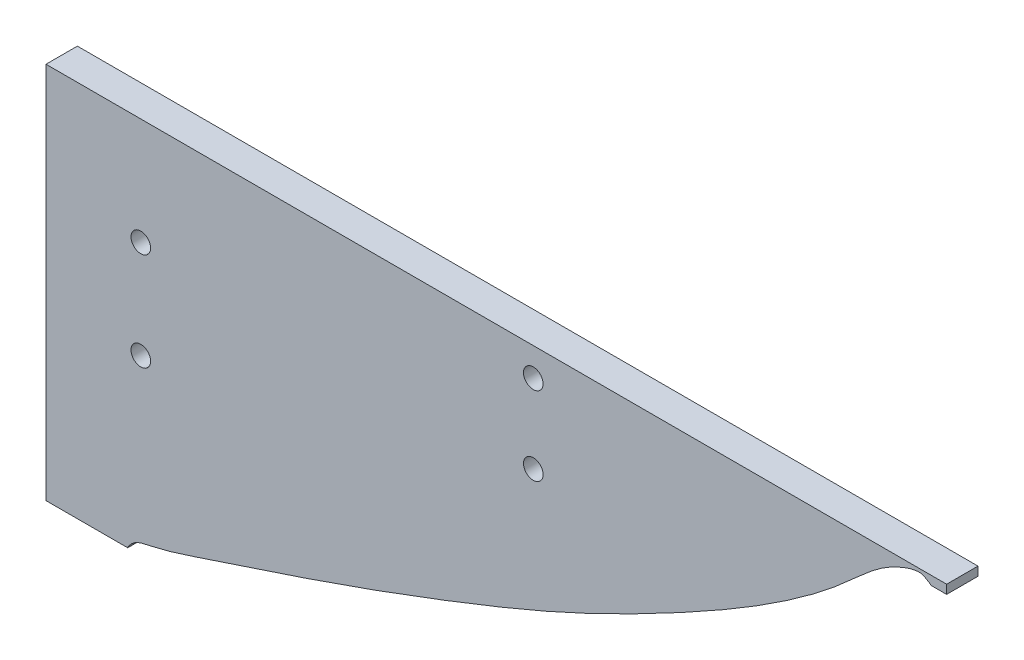
ISO-10303-21;
HEADER;
FILE_DESCRIPTION(('STEP AP214'),'2;1');
FILE_NAME('part.step','',(''),(''),'','','');
FILE_SCHEMA(('AUTOMOTIVE_DESIGN { 1 0 10303 214 1 1 1 1 }'));
ENDSEC;
DATA;
#1=APPLICATION_CONTEXT('core data for automotive mechanical design processes');
#2=APPLICATION_PROTOCOL_DEFINITION('international standard','automotive_design',2000,#1);
#3=PRODUCT_CONTEXT('',#1,'mechanical');
#4=PRODUCT('Part','Part','',(#3));
#5=PRODUCT_RELATED_PRODUCT_CATEGORY('part','',(#4));
#6=PRODUCT_DEFINITION_FORMATION('','',#4);
#7=PRODUCT_DEFINITION_CONTEXT('part definition',#1,'design');
#8=PRODUCT_DEFINITION('design','',#6,#7);
#9=PRODUCT_DEFINITION_SHAPE('','',#8);
#10=(LENGTH_UNIT() NAMED_UNIT(*) SI_UNIT(.MILLI.,.METRE.));
#11=(NAMED_UNIT(*) PLANE_ANGLE_UNIT() SI_UNIT($,.RADIAN.));
#12=(NAMED_UNIT(*) SI_UNIT($,.STERADIAN.) SOLID_ANGLE_UNIT());
#13=UNCERTAINTY_MEASURE_WITH_UNIT(LENGTH_MEASURE(1.E-05),#10,'distance_accuracy_value','');
#14=(GEOMETRIC_REPRESENTATION_CONTEXT(3) GLOBAL_UNCERTAINTY_ASSIGNED_CONTEXT((#13)) GLOBAL_UNIT_ASSIGNED_CONTEXT((#10,
#11,#12)) REPRESENTATION_CONTEXT('',''));
#15=CARTESIAN_POINT('',(0.,0.,0.));
#16=DIRECTION('',(0.,0.,1.));
#17=DIRECTION('',(1.,0.,0.));
#18=AXIS2_PLACEMENT_3D('',#15,#16,#17);
#19=CARTESIAN_POINT('',(-113.751743984979,-94.1062700443345,164.));
#20=DIRECTION('',(0.,0.,-1.));
#21=DIRECTION('',(-1.,0.,0.));
#22=AXIS2_PLACEMENT_3D('',#19,#20,#21);
#23=PLANE('',#22);
#24=CARTESIAN_POINT('',(-100.,-50.,164.));
#25=DIRECTION('',(0.,0.,-1.));
#26=DIRECTION('',(-1.,0.,0.));
#27=AXIS2_PLACEMENT_3D('',#24,#25,#26);
#28=CIRCLE('',#27,2.5);
#29=CARTESIAN_POINT('',(-102.5,-50.,164.));
#30=VERTEX_POINT('',#29);
#31=EDGE_CURVE('E207',#30,#30,#28,.F.);
#32=ORIENTED_EDGE('',*,*,#31,.F.);
#33=EDGE_LOOP('',(#32));
#34=FACE_BOUND('',#33,.T.);
#35=CARTESIAN_POINT('',(0.0705666698621599,-4.96037406111782,164.));
#36=DIRECTION('',(0.,0.,-1.));
#37=DIRECTION('',(-1.,0.,0.));
#38=AXIS2_PLACEMENT_3D('',#35,#36,#37);
#39=CIRCLE('',#38,2.5);
#40=CARTESIAN_POINT('',(-2.42943333013784,-4.96037406111782,164.));
#41=VERTEX_POINT('',#40);
#42=EDGE_CURVE('E203',#41,#41,#39,.F.);
#43=ORIENTED_EDGE('',*,*,#42,.F.);
#44=EDGE_LOOP('',(#43));
#45=FACE_BOUND('',#44,.T.);
#46=CARTESIAN_POINT('',(-103.335738248499,-94.101942914283,164.));
#47=CARTESIAN_POINT('',(-110.279741858673,-94.105282507355,164.));
#48=CARTESIAN_POINT('',(-117.223745960721,-94.1076749958076,164.));
#49=CARTESIAN_POINT('',(-124.167750173155,-94.1093449309054,164.));
#50=B_SPLINE_CURVE_WITH_KNOTS('',3,(#46,#47,#48,#49),.UNSPECIFIED.,.F.,.F.,(4,4),(0.,1.),.UNSPECIFIED.);
#51=CARTESIAN_POINT('',(-124.167750173155,-94.1093449309054,164.));
#52=VERTEX_POINT('',#51);
#53=CARTESIAN_POINT('',(-103.335738248499,-94.1019429142831,164.));
#54=VERTEX_POINT('',#53);
#55=EDGE_CURVE('E161',#52,#54,#50,.F.);
#56=ORIENTED_EDGE('',*,*,#55,.T.);
#57=CARTESIAN_POINT('',(101.392971002908,0.,164.));
#58=CARTESIAN_POINT('',(101.357979740018,0.068190974845596,164.));
#59=CARTESIAN_POINT('',(101.312259751955,0.130180594414461,164.));
#60=CARTESIAN_POINT('',(101.208007132626,0.239375916834823,164.));
#61=CARTESIAN_POINT('',(101.148823438813,0.288099413869145,164.));
#62=CARTESIAN_POINT('',(100.96386004211,0.423104213829059,164.));
#63=CARTESIAN_POINT('',(100.833204582962,0.501109621826331,164.));
#64=CARTESIAN_POINT('',(100.443182520159,0.73830115292209,164.));
#65=CARTESIAN_POINT('',(100.188555675596,0.90522789084138,164.));
#66=CARTESIAN_POINT('',(99.7805419205078,1.11303675559708,164.));
#67=CARTESIAN_POINT('',(99.6425820034649,1.1761913142262,164.));
#68=CARTESIAN_POINT('',(99.3592983750823,1.27931939161136,164.));
#69=CARTESIAN_POINT('',(99.2136623255998,1.31832692398525,164.));
#70=CARTESIAN_POINT('',(98.9152639127084,1.37393930102966,164.));
#71=CARTESIAN_POINT('',(98.762030141973,1.39046433640759,164.));
#72=CARTESIAN_POINT('',(98.4590300872123,1.40479846347273,164.));
#73=CARTESIAN_POINT('',(98.3079905188349,1.40293617943599,164.));
#74=CARTESIAN_POINT('',(97.8558429143128,1.37830657892934,164.));
#75=CARTESIAN_POINT('',(97.555027649507,1.3369050844726,164.));
#76=CARTESIAN_POINT('',(96.95759664681,1.2275966619729,164.));
#77=CARTESIAN_POINT('',(96.6631542560784,1.16103962624218,164.));
#78=CARTESIAN_POINT('',(95.790945562899,0.930397800976953,164.));
#79=CARTESIAN_POINT('',(95.2242489555142,0.735478181923143,164.));
#80=CARTESIAN_POINT('',(94.1046442302498,0.307230864748438,164.));
#81=CARTESIAN_POINT('',(93.552174654694,0.0726815993023446,164.));
#82=CARTESIAN_POINT('',(92.4603527379176,-0.432955217621019,164.));
#83=CARTESIAN_POINT('',(91.9202514383574,-0.703814257286526,164.));
#84=CARTESIAN_POINT('',(90.3358328449802,-1.55597254541287,164.));
#85=CARTESIAN_POINT('',(89.3220610695959,-2.18133859050563,164.));
#86=CARTESIAN_POINT('',(86.4043153585391,-4.22389431218765,164.));
#87=CARTESIAN_POINT('',(84.6154939618158,-5.79620313911845,164.));
#88=CARTESIAN_POINT('',(81.9584007689516,-8.18987745119697,164.));
#89=CARTESIAN_POINT('',(81.0760084523988,-8.99220379670843,164.));
#90=CARTESIAN_POINT('',(79.2948121414599,-10.5749627983275,164.));
#91=CARTESIAN_POINT('',(78.3977815598141,-11.3577721797525,164.));
#92=CARTESIAN_POINT('',(75.6724480026155,-13.6605789035911,164.));
#93=CARTESIAN_POINT('',(73.808154251943,-15.1326246285187,164.));
#94=CARTESIAN_POINT('',(70.0160592997156,-17.9921031468079,164.));
#95=CARTESIAN_POINT('',(68.0886874462912,-19.3801079738989,164.));
#96=CARTESIAN_POINT('',(64.1875447955719,-22.0942988870055,164.));
#97=CARTESIAN_POINT('',(62.2130224574577,-23.4194836720551,164.));
#98=CARTESIAN_POINT('',(58.2157142582294,-26.0055502649134,164.));
#99=CARTESIAN_POINT('',(56.1940211806163,-27.2669389252496,164.));
#100=CARTESIAN_POINT('',(52.1213904733241,-29.7357364883915,164.));
#101=CARTESIAN_POINT('',(50.0694521137147,-30.9440109694953,164.));
#102=CARTESIAN_POINT('',(45.9433407087062,-33.3233797876428,164.));
#103=CARTESIAN_POINT('',(43.869058606885,-34.4941949818839,164.));
#104=CARTESIAN_POINT('',(37.6197095530705,-37.9565610613408,164.));
#105=CARTESIAN_POINT('',(33.4167725220308,-40.1997349563943,164.));
#106=CARTESIAN_POINT('',(24.9571366174578,-44.5763972859292,164.));
#107=CARTESIAN_POINT('',(20.7007921032042,-46.7107537785107,164.));
#108=CARTESIAN_POINT('',(12.1185466451993,-50.8379374737022,164.));
#109=CARTESIAN_POINT('',(7.78892751637958,-52.8271833657396,164.));
#110=CARTESIAN_POINT('',(-0.93686045361445,-56.6480378714663,164.));
#111=CARTESIAN_POINT('',(-5.33198140330631,-58.4806654519202,164.));
#112=CARTESIAN_POINT('',(-14.1632962870766,-62.0467656114054,164.));
#113=CARTESIAN_POINT('',(-18.5983001543649,-63.7841269838945,164.));
#114=CARTESIAN_POINT('',(-27.4893002002402,-67.2027967759074,164.));
#115=CARTESIAN_POINT('',(-31.9458744530792,-68.8823291062009,164.));
#116=CARTESIAN_POINT('',(-40.8856414493109,-72.1697590507888,164.));
#117=CARTESIAN_POINT('',(-45.3695033104159,-73.7766223180661,164.));
#118=CARTESIAN_POINT('',(-54.362678798266,-76.9180042234424,164.));
#119=CARTESIAN_POINT('',(-58.8717588633553,-78.4526275518555,164.));
#120=CARTESIAN_POINT('',(-67.9018492888758,-81.4865682910888,164.));
#121=CARTESIAN_POINT('',(-72.4221643800262,-82.9878336641147,164.));
#122=CARTESIAN_POINT('',(-79.2053872172963,-85.2313458119901,164.));
#123=CARTESIAN_POINT('',(-81.4668429971368,-85.9780530829574,164.));
#124=CARTESIAN_POINT('',(-84.862097162731,-87.0887081801202,164.));
#125=CARTESIAN_POINT('',(-85.9943690295218,-87.4573312222522,164.));
#126=CARTESIAN_POINT('',(-88.2598665539023,-88.1916538319368,164.));
#127=CARTESIAN_POINT('',(-89.3921986933781,-88.5606335458748,164.));
#128=CARTESIAN_POINT('',(-91.6631776616176,-89.274972763368,164.));
#129=CARTESIAN_POINT('',(-92.802852417256,-89.6166166410121,164.));
#130=CARTESIAN_POINT('',(-94.5267961312985,-90.0755469010516,164.));
#131=CARTESIAN_POINT('',(-95.1037590980684,-90.2199356735893,164.));
#132=CARTESIAN_POINT('',(-96.2626988106407,-90.4901140466114,164.));
#133=CARTESIAN_POINT('',(-96.8456888153453,-90.6121448502808,164.));
#134=CARTESIAN_POINT('',(-98.0125509186469,-90.8529342320259,164.));
#135=CARTESIAN_POINT('',(-98.595260087011,-90.9760068293969,164.));
#136=CARTESIAN_POINT('',(-99.4582669239013,-91.201632586255,164.));
#137=CARTESIAN_POINT('',(-99.7438572238623,-91.2834156130484,164.));
#138=CARTESIAN_POINT('',(-100.306954414545,-91.4677858129975,164.));
#139=CARTESIAN_POINT('',(-100.584410762881,-91.5709472015601,164.));
#140=CARTESIAN_POINT('',(-101.125195334734,-91.8151646548845,164.));
#141=CARTESIAN_POINT('',(-101.390540825819,-91.958078572796,164.));
#142=CARTESIAN_POINT('',(-101.877557183888,-92.2877867261056,164.));
#143=CARTESIAN_POINT('',(-102.098498784361,-92.4783319788356,164.));
#144=CARTESIAN_POINT('',(-102.511988709742,-92.8917471293423,164.));
#145=CARTESIAN_POINT('',(-102.701463941397,-93.1183296851382,164.));
#146=CARTESIAN_POINT('',(-102.982389608421,-93.4612729552289,164.));
#147=CARTESIAN_POINT('',(-103.074450206361,-93.5767336294033,164.));
#148=CARTESIAN_POINT('',(-103.2377734881,-93.8227310294766,164.));
#149=CARTESIAN_POINT('',(-103.307943701218,-93.9561350127491,164.));
#150=CARTESIAN_POINT('',(-103.335738248499,-94.1019429142831,164.));
#151=B_SPLINE_CURVE_WITH_KNOTS('',3,(#57,#58,#59,#60,#61,#62,#63,#64,#65,#66,#67,#68,#69,#70,
#71,#72,#73,#74,#75,#76,#77,#78,#79,#80,#81,#82,#83,#84,#85,#86,#87,#88,#89,#90,#91,#92,#93,#94,
#95,#96,#97,#98,#99,#100,#101,#102,#103,#104,#105,#106,#107,#108,#109,#110,#111,#112,#113,#114,
#115,#116,#117,#118,#119,#120,#121,#122,#123,#124,#125,#126,#127,#128,#129,#130,#131,#132,#133,
#134,#135,#136,#137,#138,#139,#140,#141,#142,#143,#144,#145,#146,#147,#148,#149,#150),
.UNSPECIFIED.,.F.,.F.,(4,2,2,2,2,2,2,2,2,2,2,2,2,2,2,2,2,2,2,2,2,2,2,2,2,2,2,2,2,2,2,2,2,2,2,2,
2,2,2,2,2,2,2,2,2,2,4),(0.,0.000976562500000111,0.00195312500000022,0.00390625000000022,
0.00781250000000044,0.00976562500000044,0.0117187500000006,0.0136718750000006,
0.0156250000000007,0.0195312500000006,0.0234375000000006,0.0312500000000007,0.0390625000000007,
0.0468750000000008,0.0625000000000009,0.0937500000000011,0.109375000000001,0.125000000000001,
0.156250000000001,0.187500000000001,0.218750000000001,0.250000000000001,0.281250000000001,
0.312500000000001,0.375000000000001,0.437500000000001,0.500000000000001,0.562500000000001,
0.625000000000001,0.687500000000001,0.750000000000001,0.8125,0.875,0.90625,0.921875,0.9375,
0.953125,0.9609375,0.96875,0.9765625,0.98046875,0.984375,0.98828125,0.9921875,0.99609375,
0.998046875,1.),.UNSPECIFIED.);
#152=CARTESIAN_POINT('',(101.392971002908,0.,164.));
#153=VERTEX_POINT('',#152);
#154=EDGE_CURVE('E88',#54,#153,#151,.F.);
#155=ORIENTED_EDGE('',*,*,#154,.T.);
#156=DIRECTION('',(1.,0.,0.));
#157=VECTOR('',#156,1.);
#158=CARTESIAN_POINT('',(101.392971002908,0.,164.));
#159=LINE('',#158,#157);
#160=CARTESIAN_POINT('',(105.452125778528,0.,164.));
#161=VERTEX_POINT('',#160);
#162=EDGE_CURVE('E102',#153,#161,#159,.T.);
#163=ORIENTED_EDGE('',*,*,#162,.T.);
#164=DIRECTION('',(0.,1.,0.));
#165=VECTOR('',#164,1.);
#166=CARTESIAN_POINT('',(105.452125778528,2.25600000000004,164.));
#167=LINE('',#166,#165);
#168=CARTESIAN_POINT('',(105.452125778528,2.25600000000004,164.));
#169=VERTEX_POINT('',#168);
#170=EDGE_CURVE('E96',#161,#169,#167,.T.);
#171=ORIENTED_EDGE('',*,*,#170,.T.);
#172=DIRECTION('',(-1.,0.,0.));
#173=VECTOR('',#172,1.);
#174=CARTESIAN_POINT('',(105.452125778528,2.25600000000004,164.));
#175=LINE('',#174,#173);
#176=CARTESIAN_POINT('',(-124.167750173155,2.25600000000001,164.));
#177=VERTEX_POINT('',#176);
#178=EDGE_CURVE('E100',#169,#177,#175,.T.);
#179=ORIENTED_EDGE('',*,*,#178,.T.);
#180=DIRECTION('',(0.,-1.,0.));
#181=VECTOR('',#180,1.);
#182=CARTESIAN_POINT('',(-124.167750173155,-94.1093449309054,164.));
#183=LINE('',#182,#181);
#184=EDGE_CURVE('E51',#177,#52,#183,.T.);
#185=ORIENTED_EDGE('',*,*,#184,.T.);
#186=EDGE_LOOP('',(#56,#155,#163,#171,#179,#185));
#187=FACE_BOUND('',#186,.T.);
#188=CARTESIAN_POINT('',(0.0705666698621599,-25.,164.));
#189=DIRECTION('',(0.,0.,-1.));
#190=DIRECTION('',(-1.,0.,0.));
#191=AXIS2_PLACEMENT_3D('',#188,#189,#190);
#192=CIRCLE('',#191,2.5);
#193=CARTESIAN_POINT('',(-2.42943333013784,-25.,164.));
#194=VERTEX_POINT('',#193);
#195=EDGE_CURVE('E204',#194,#194,#192,.F.);
#196=ORIENTED_EDGE('',*,*,#195,.F.);
#197=EDGE_LOOP('',(#196));
#198=FACE_BOUND('',#197,.T.);
#199=CARTESIAN_POINT('',(-100.,-25.,164.));
#200=DIRECTION('',(0.,0.,-1.));
#201=DIRECTION('',(-1.,0.,0.));
#202=AXIS2_PLACEMENT_3D('',#199,#200,#201);
#203=CIRCLE('',#202,2.5);
#204=CARTESIAN_POINT('',(-102.5,-25.,164.));
#205=VERTEX_POINT('',#204);
#206=EDGE_CURVE('E210',#205,#205,#203,.F.);
#207=ORIENTED_EDGE('',*,*,#206,.F.);
#208=EDGE_LOOP('',(#207));
#209=FACE_BOUND('',#208,.T.);
#210=ADVANCED_FACE('F30',(#34,#45,#187,#198,#209),#23,.F.);
#211=CARTESIAN_POINT('',(-113.751743984979,-94.1062700443345,156.));
#212=DIRECTION('',(0.,0.,-1.));
#213=DIRECTION('',(-1.,0.,0.));
#214=AXIS2_PLACEMENT_3D('',#211,#212,#213);
#215=PLANE('',#214);
#216=CARTESIAN_POINT('',(-100.,-50.,156.));
#217=DIRECTION('',(0.,0.,-1.));
#218=DIRECTION('',(-1.,0.,0.));
#219=AXIS2_PLACEMENT_3D('',#216,#217,#218);
#220=CIRCLE('',#219,2.5);
#221=CARTESIAN_POINT('',(-102.5,-50.,156.));
#222=VERTEX_POINT('',#221);
#223=EDGE_CURVE('E208',#222,#222,#220,.F.);
#224=ORIENTED_EDGE('',*,*,#223,.T.);
#225=EDGE_LOOP('',(#224));
#226=FACE_BOUND('',#225,.T.);
#227=CARTESIAN_POINT('',(0.0705666698621599,-4.96037406111782,156.));
#228=DIRECTION('',(0.,0.,-1.));
#229=DIRECTION('',(-1.,0.,0.));
#230=AXIS2_PLACEMENT_3D('',#227,#228,#229);
#231=CIRCLE('',#230,2.5);
#232=CARTESIAN_POINT('',(-2.42943333013784,-4.96037406111782,156.));
#233=VERTEX_POINT('',#232);
#234=EDGE_CURVE('E200',#233,#233,#231,.F.);
#235=ORIENTED_EDGE('',*,*,#234,.T.);
#236=EDGE_LOOP('',(#235));
#237=FACE_BOUND('',#236,.T.);
#238=CARTESIAN_POINT('',(-124.167750173155,-94.1093449309054,156.));
#239=CARTESIAN_POINT('',(-117.223745960721,-94.1076749958076,156.));
#240=CARTESIAN_POINT('',(-110.279741858673,-94.105282507355,156.));
#241=CARTESIAN_POINT('',(-103.335738248499,-94.101942914283,156.));
#242=B_SPLINE_CURVE_WITH_KNOTS('',3,(#238,#239,#240,#241),.UNSPECIFIED.,.F.,.F.,(4,4),(0.,1.),.UNSPECIFIED.);
#243=CARTESIAN_POINT('',(-124.167750173155,-94.1093449309054,156.));
#244=VERTEX_POINT('',#243);
#245=CARTESIAN_POINT('',(-103.335738248499,-94.1019429142831,156.));
#246=VERTEX_POINT('',#245);
#247=EDGE_CURVE('E178',#244,#246,#242,.T.);
#248=ORIENTED_EDGE('',*,*,#247,.F.);
#249=DIRECTION('',(0.,-1.,0.));
#250=VECTOR('',#249,1.);
#251=CARTESIAN_POINT('',(-124.167750173155,-94.1093449309054,156.));
#252=LINE('',#251,#250);
#253=CARTESIAN_POINT('',(-124.167750173155,2.25600000000001,156.));
#254=VERTEX_POINT('',#253);
#255=EDGE_CURVE('E80',#254,#244,#252,.T.);
#256=ORIENTED_EDGE('',*,*,#255,.F.);
#257=DIRECTION('',(-1.,0.,0.));
#258=VECTOR('',#257,1.);
#259=CARTESIAN_POINT('',(105.452125778528,2.25600000000004,156.));
#260=LINE('',#259,#258);
#261=CARTESIAN_POINT('',(105.452125778528,2.25600000000004,156.));
#262=VERTEX_POINT('',#261);
#263=EDGE_CURVE('E74',#262,#254,#260,.T.);
#264=ORIENTED_EDGE('',*,*,#263,.F.);
#265=DIRECTION('',(0.,1.,0.));
#266=VECTOR('',#265,1.);
#267=CARTESIAN_POINT('',(105.452125778528,2.25600000000004,156.));
#268=LINE('',#267,#266);
#269=CARTESIAN_POINT('',(105.452125778528,0.,156.));
#270=VERTEX_POINT('',#269);
#271=EDGE_CURVE('E110',#270,#262,#268,.T.);
#272=ORIENTED_EDGE('',*,*,#271,.F.);
#273=DIRECTION('',(1.,0.,0.));
#274=VECTOR('',#273,1.);
#275=CARTESIAN_POINT('',(101.392971002908,0.,156.));
#276=LINE('',#275,#274);
#277=CARTESIAN_POINT('',(101.392971002908,0.,156.));
#278=VERTEX_POINT('',#277);
#279=EDGE_CURVE('E121',#278,#270,#276,.T.);
#280=ORIENTED_EDGE('',*,*,#279,.F.);
#281=CARTESIAN_POINT('',(-103.335738248499,-94.1019429142831,156.));
#282=CARTESIAN_POINT('',(-103.307943701218,-93.9561350127491,156.));
#283=CARTESIAN_POINT('',(-103.2377734881,-93.8227310294766,156.));
#284=CARTESIAN_POINT('',(-103.074450206361,-93.5767336294033,156.));
#285=CARTESIAN_POINT('',(-102.982389608421,-93.4612729552289,156.));
#286=CARTESIAN_POINT('',(-102.701463941397,-93.1183296851382,156.));
#287=CARTESIAN_POINT('',(-102.511988709742,-92.8917471293423,156.));
#288=CARTESIAN_POINT('',(-102.098498784361,-92.4783319788356,156.));
#289=CARTESIAN_POINT('',(-101.877557183888,-92.2877867261056,156.));
#290=CARTESIAN_POINT('',(-101.390540825819,-91.958078572796,156.));
#291=CARTESIAN_POINT('',(-101.125195334734,-91.8151646548845,156.));
#292=CARTESIAN_POINT('',(-100.584410762881,-91.5709472015601,156.));
#293=CARTESIAN_POINT('',(-100.306954414545,-91.4677858129975,156.));
#294=CARTESIAN_POINT('',(-99.7438572238623,-91.2834156130484,156.));
#295=CARTESIAN_POINT('',(-99.4582669239013,-91.201632586255,156.));
#296=CARTESIAN_POINT('',(-98.595260087011,-90.9760068293969,156.));
#297=CARTESIAN_POINT('',(-98.0125509186469,-90.8529342320259,156.));
#298=CARTESIAN_POINT('',(-96.8456888153453,-90.6121448502808,156.));
#299=CARTESIAN_POINT('',(-96.2626988106407,-90.4901140466114,156.));
#300=CARTESIAN_POINT('',(-95.1037590980684,-90.2199356735893,156.));
#301=CARTESIAN_POINT('',(-94.5267961312985,-90.0755469010516,156.));
#302=CARTESIAN_POINT('',(-92.802852417256,-89.6166166410121,156.));
#303=CARTESIAN_POINT('',(-91.6631776616176,-89.274972763368,156.));
#304=CARTESIAN_POINT('',(-89.3921986933781,-88.5606335458748,156.));
#305=CARTESIAN_POINT('',(-88.2598665539023,-88.1916538319368,156.));
#306=CARTESIAN_POINT('',(-85.9943690295218,-87.4573312222522,156.));
#307=CARTESIAN_POINT('',(-84.862097162731,-87.0887081801202,156.));
#308=CARTESIAN_POINT('',(-81.4668429971368,-85.9780530829574,156.));
#309=CARTESIAN_POINT('',(-79.2053872172963,-85.2313458119901,156.));
#310=CARTESIAN_POINT('',(-72.4221643800262,-82.9878336641147,156.));
#311=CARTESIAN_POINT('',(-67.9018492888758,-81.4865682910888,156.));
#312=CARTESIAN_POINT('',(-58.8717588633553,-78.4526275518555,156.));
#313=CARTESIAN_POINT('',(-54.362678798266,-76.9180042234424,156.));
#314=CARTESIAN_POINT('',(-45.3695033104159,-73.7766223180661,156.));
#315=CARTESIAN_POINT('',(-40.8856414493109,-72.1697590507888,156.));
#316=CARTESIAN_POINT('',(-31.9458744530792,-68.8823291062009,156.));
#317=CARTESIAN_POINT('',(-27.4893002002402,-67.2027967759074,156.));
#318=CARTESIAN_POINT('',(-18.5983001543649,-63.7841269838945,156.));
#319=CARTESIAN_POINT('',(-14.1632962870766,-62.0467656114054,156.));
#320=CARTESIAN_POINT('',(-5.33198140330631,-58.4806654519202,156.));
#321=CARTESIAN_POINT('',(-0.93686045361445,-56.6480378714663,156.));
#322=CARTESIAN_POINT('',(7.78892751637958,-52.8271833657396,156.));
#323=CARTESIAN_POINT('',(12.1185466451993,-50.8379374737022,156.));
#324=CARTESIAN_POINT('',(20.7007921032042,-46.7107537785107,156.));
#325=CARTESIAN_POINT('',(24.9571366174578,-44.5763972859292,156.));
#326=CARTESIAN_POINT('',(33.4167725220308,-40.1997349563943,156.));
#327=CARTESIAN_POINT('',(37.6197095530705,-37.9565610613408,156.));
#328=CARTESIAN_POINT('',(43.869058606885,-34.4941949818839,156.));
#329=CARTESIAN_POINT('',(45.9433407087062,-33.3233797876428,156.));
#330=CARTESIAN_POINT('',(50.0694521137147,-30.9440109694953,156.));
#331=CARTESIAN_POINT('',(52.1213904733241,-29.7357364883915,156.));
#332=CARTESIAN_POINT('',(56.1940211806163,-27.2669389252496,156.));
#333=CARTESIAN_POINT('',(58.2157142582294,-26.0055502649134,156.));
#334=CARTESIAN_POINT('',(62.2130224574577,-23.4194836720551,156.));
#335=CARTESIAN_POINT('',(64.1875447955719,-22.0942988870055,156.));
#336=CARTESIAN_POINT('',(68.0886874462912,-19.3801079738989,156.));
#337=CARTESIAN_POINT('',(70.0160592997156,-17.9921031468079,156.));
#338=CARTESIAN_POINT('',(73.808154251943,-15.1326246285187,156.));
#339=CARTESIAN_POINT('',(75.6724480026155,-13.6605789035911,156.));
#340=CARTESIAN_POINT('',(78.3977815598141,-11.3577721797525,156.));
#341=CARTESIAN_POINT('',(79.2948121414599,-10.5749627983275,156.));
#342=CARTESIAN_POINT('',(81.0760084523988,-8.99220379670843,156.));
#343=CARTESIAN_POINT('',(81.9584007689516,-8.18987745119697,156.));
#344=CARTESIAN_POINT('',(84.6154939618158,-5.79620313911845,156.));
#345=CARTESIAN_POINT('',(86.4043153585391,-4.22389431218765,156.));
#346=CARTESIAN_POINT('',(89.3220610695959,-2.18133859050563,156.));
#347=CARTESIAN_POINT('',(90.3358328449802,-1.55597254541287,156.));
#348=CARTESIAN_POINT('',(91.9202514383574,-0.703814257286526,156.));
#349=CARTESIAN_POINT('',(92.4603527379176,-0.432955217621019,156.));
#350=CARTESIAN_POINT('',(93.552174654694,0.0726815993023446,156.));
#351=CARTESIAN_POINT('',(94.1046442302498,0.307230864748438,156.));
#352=CARTESIAN_POINT('',(95.2242489555142,0.735478181923143,156.));
#353=CARTESIAN_POINT('',(95.790945562899,0.930397800976953,156.));
#354=CARTESIAN_POINT('',(96.6631542560784,1.16103962624218,156.));
#355=CARTESIAN_POINT('',(96.95759664681,1.2275966619729,156.));
#356=CARTESIAN_POINT('',(97.555027649507,1.3369050844726,156.));
#357=CARTESIAN_POINT('',(97.8558429143128,1.37830657892934,156.));
#358=CARTESIAN_POINT('',(98.3079905188349,1.40293617943599,156.));
#359=CARTESIAN_POINT('',(98.4590300872123,1.40479846347273,156.));
#360=CARTESIAN_POINT('',(98.762030141973,1.39046433640759,156.));
#361=CARTESIAN_POINT('',(98.9152639127084,1.37393930102966,156.));
#362=CARTESIAN_POINT('',(99.2136623255998,1.31832692398525,156.));
#363=CARTESIAN_POINT('',(99.3592983750823,1.27931939161136,156.));
#364=CARTESIAN_POINT('',(99.6425820034649,1.1761913142262,156.));
#365=CARTESIAN_POINT('',(99.7805419205078,1.11303675559708,156.));
#366=CARTESIAN_POINT('',(100.188555675596,0.90522789084138,156.));
#367=CARTESIAN_POINT('',(100.443182520159,0.73830115292209,156.));
#368=CARTESIAN_POINT('',(100.833204582962,0.501109621826331,156.));
#369=CARTESIAN_POINT('',(100.96386004211,0.423104213829059,156.));
#370=CARTESIAN_POINT('',(101.148823438813,0.288099413869145,156.));
#371=CARTESIAN_POINT('',(101.208007132626,0.239375916834823,156.));
#372=CARTESIAN_POINT('',(101.312259751955,0.130180594414461,156.));
#373=CARTESIAN_POINT('',(101.357979740018,0.068190974845596,156.));
#374=CARTESIAN_POINT('',(101.392971002908,0.,156.));
#375=B_SPLINE_CURVE_WITH_KNOTS('',3,(#281,#282,#283,#284,#285,#286,#287,#288,#289,#290,#291,
#292,#293,#294,#295,#296,#297,#298,#299,#300,#301,#302,#303,#304,#305,#306,#307,#308,#309,#310,
#311,#312,#313,#314,#315,#316,#317,#318,#319,#320,#321,#322,#323,#324,#325,#326,#327,#328,#329,
#330,#331,#332,#333,#334,#335,#336,#337,#338,#339,#340,#341,#342,#343,#344,#345,#346,#347,#348,
#349,#350,#351,#352,#353,#354,#355,#356,#357,#358,#359,#360,#361,#362,#363,#364,#365,#366,#367,
#368,#369,#370,#371,#372,#373,#374),.UNSPECIFIED.,.F.,.F.,(4,2,2,2,2,2,2,2,2,2,2,2,2,2,2,2,2,2,
2,2,2,2,2,2,2,2,2,2,2,2,2,2,2,2,2,2,2,2,2,2,2,2,2,2,2,2,4),(0.,0.00195312500000011,
0.00390625000000022,0.00781250000000011,0.0117187500000001,0.0156250000000001,
0.0195312500000001,0.0234375,0.03125,0.0390624999999999,0.0468749999999999,0.0624999999999999,
0.0781249999999999,0.0937499999999999,0.125,0.1875,0.249999999999999,0.312499999999999,
0.374999999999999,0.437499999999999,0.499999999999999,0.562499999999999,0.624999999999999,
0.687499999999999,0.718749999999999,0.749999999999999,0.781249999999999,0.812499999999999,
0.843749999999999,0.874999999999999,0.890624999999999,0.906249999999999,0.937499999999999,
0.953124999999999,0.960937499999999,0.968749999999999,0.976562499999999,0.980468749999999,
0.984374999999999,0.986328124999999,0.988281249999999,0.990234375,0.9921875,0.99609375,
0.998046875,0.9990234375,1.),.UNSPECIFIED.);
#376=EDGE_CURVE('E258',#246,#278,#375,.T.);
#377=ORIENTED_EDGE('',*,*,#376,.F.);
#378=EDGE_LOOP('',(#248,#256,#264,#272,#280,#377));
#379=FACE_BOUND('',#378,.T.);
#380=CARTESIAN_POINT('',(0.0705666698621599,-25.,156.));
#381=DIRECTION('',(0.,0.,-1.));
#382=DIRECTION('',(-1.,0.,0.));
#383=AXIS2_PLACEMENT_3D('',#380,#381,#382);
#384=CIRCLE('',#383,2.5);
#385=CARTESIAN_POINT('',(-2.42943333013784,-25.,156.));
#386=VERTEX_POINT('',#385);
#387=EDGE_CURVE('E205',#386,#386,#384,.F.);
#388=ORIENTED_EDGE('',*,*,#387,.T.);
#389=EDGE_LOOP('',(#388));
#390=FACE_BOUND('',#389,.T.);
#391=CARTESIAN_POINT('',(-100.,-25.,156.));
#392=DIRECTION('',(0.,0.,-1.));
#393=DIRECTION('',(-1.,0.,0.));
#394=AXIS2_PLACEMENT_3D('',#391,#392,#393);
#395=CIRCLE('',#394,2.5);
#396=CARTESIAN_POINT('',(-102.5,-25.,156.));
#397=VERTEX_POINT('',#396);
#398=EDGE_CURVE('E36',#397,#397,#395,.F.);
#399=ORIENTED_EDGE('',*,*,#398,.T.);
#400=EDGE_LOOP('',(#399));
#401=FACE_BOUND('',#400,.T.);
#402=ADVANCED_FACE('F139',(#226,#237,#379,#390,#401),#215,.T.);
#403=CARTESIAN_POINT('',(-124.167750173155,-94.1093449309054,164.));
#404=CARTESIAN_POINT('',(-117.223745960721,-94.1076749958076,164.));
#405=CARTESIAN_POINT('',(-110.279741858673,-94.105282507355,164.));
#406=CARTESIAN_POINT('',(-103.335738248499,-94.101942914283,164.));
#407=B_SPLINE_CURVE_WITH_KNOTS('',3,(#403,#404,#405,#406),.UNSPECIFIED.,.F.,.F.,(4,4),(0.,1.),.UNSPECIFIED.);
#408=DIRECTION('',(0.,0.,-1.));
#409=VECTOR('',#408,1.);
#410=SURFACE_OF_LINEAR_EXTRUSION('',#407,#409);
#411=ORIENTED_EDGE('',*,*,#247,.T.);
#412=DIRECTION('',(0.,0.,-1.));
#413=VECTOR('',#412,1.);
#414=CARTESIAN_POINT('',(-103.335738248499,-94.1019429142831,164.));
#415=LINE('',#414,#413);
#416=EDGE_CURVE('E11',#54,#246,#415,.T.);
#417=ORIENTED_EDGE('',*,*,#416,.F.);
#418=ORIENTED_EDGE('',*,*,#55,.F.);
#419=DIRECTION('',(0.,0.,-1.));
#420=VECTOR('',#419,1.);
#421=CARTESIAN_POINT('',(-124.167750173155,-94.1093449309054,164.));
#422=LINE('',#421,#420);
#423=EDGE_CURVE('E116',#52,#244,#422,.T.);
#424=ORIENTED_EDGE('',*,*,#423,.T.);
#425=EDGE_LOOP('',(#411,#417,#418,#424));
#426=FACE_BOUND('',#425,.T.);
#427=ADVANCED_FACE('F32',(#426),#410,.F.);
#428=CARTESIAN_POINT('',(-103.335738248499,-94.1019429142831,164.));
#429=CARTESIAN_POINT('',(-103.307943701218,-93.9561350127491,164.));
#430=CARTESIAN_POINT('',(-103.2377734881,-93.8227310294766,164.));
#431=CARTESIAN_POINT('',(-103.074450206361,-93.5767336294033,164.));
#432=CARTESIAN_POINT('',(-102.982389608421,-93.4612729552289,164.));
#433=CARTESIAN_POINT('',(-102.701463941397,-93.1183296851382,164.));
#434=CARTESIAN_POINT('',(-102.511988709742,-92.8917471293423,164.));
#435=CARTESIAN_POINT('',(-102.098498784361,-92.4783319788356,164.));
#436=CARTESIAN_POINT('',(-101.877557183888,-92.2877867261056,164.));
#437=CARTESIAN_POINT('',(-101.390540825819,-91.958078572796,164.));
#438=CARTESIAN_POINT('',(-101.125195334734,-91.8151646548845,164.));
#439=CARTESIAN_POINT('',(-100.584410762881,-91.5709472015601,164.));
#440=CARTESIAN_POINT('',(-100.306954414545,-91.4677858129975,164.));
#441=CARTESIAN_POINT('',(-99.7438572238623,-91.2834156130484,164.));
#442=CARTESIAN_POINT('',(-99.4582669239013,-91.201632586255,164.));
#443=CARTESIAN_POINT('',(-98.595260087011,-90.9760068293969,164.));
#444=CARTESIAN_POINT('',(-98.0125509186469,-90.8529342320259,164.));
#445=CARTESIAN_POINT('',(-96.8456888153453,-90.6121448502808,164.));
#446=CARTESIAN_POINT('',(-96.2626988106407,-90.4901140466114,164.));
#447=CARTESIAN_POINT('',(-95.1037590980684,-90.2199356735893,164.));
#448=CARTESIAN_POINT('',(-94.5267961312985,-90.0755469010516,164.));
#449=CARTESIAN_POINT('',(-92.802852417256,-89.6166166410121,164.));
#450=CARTESIAN_POINT('',(-91.6631776616176,-89.274972763368,164.));
#451=CARTESIAN_POINT('',(-89.3921986933781,-88.5606335458748,164.));
#452=CARTESIAN_POINT('',(-88.2598665539023,-88.1916538319368,164.));
#453=CARTESIAN_POINT('',(-85.9943690295218,-87.4573312222522,164.));
#454=CARTESIAN_POINT('',(-84.862097162731,-87.0887081801202,164.));
#455=CARTESIAN_POINT('',(-81.4668429971368,-85.9780530829574,164.));
#456=CARTESIAN_POINT('',(-79.2053872172963,-85.2313458119901,164.));
#457=CARTESIAN_POINT('',(-72.4221643800262,-82.9878336641147,164.));
#458=CARTESIAN_POINT('',(-67.9018492888758,-81.4865682910888,164.));
#459=CARTESIAN_POINT('',(-58.8717588633553,-78.4526275518555,164.));
#460=CARTESIAN_POINT('',(-54.362678798266,-76.9180042234424,164.));
#461=CARTESIAN_POINT('',(-45.3695033104159,-73.7766223180661,164.));
#462=CARTESIAN_POINT('',(-40.8856414493109,-72.1697590507888,164.));
#463=CARTESIAN_POINT('',(-31.9458744530792,-68.8823291062009,164.));
#464=CARTESIAN_POINT('',(-27.4893002002402,-67.2027967759074,164.));
#465=CARTESIAN_POINT('',(-18.5983001543649,-63.7841269838945,164.));
#466=CARTESIAN_POINT('',(-14.1632962870766,-62.0467656114054,164.));
#467=CARTESIAN_POINT('',(-5.33198140330631,-58.4806654519202,164.));
#468=CARTESIAN_POINT('',(-0.93686045361445,-56.6480378714663,164.));
#469=CARTESIAN_POINT('',(7.78892751637958,-52.8271833657396,164.));
#470=CARTESIAN_POINT('',(12.1185466451993,-50.8379374737022,164.));
#471=CARTESIAN_POINT('',(20.7007921032042,-46.7107537785107,164.));
#472=CARTESIAN_POINT('',(24.9571366174578,-44.5763972859292,164.));
#473=CARTESIAN_POINT('',(33.4167725220308,-40.1997349563943,164.));
#474=CARTESIAN_POINT('',(37.6197095530705,-37.9565610613408,164.));
#475=CARTESIAN_POINT('',(43.869058606885,-34.4941949818839,164.));
#476=CARTESIAN_POINT('',(45.9433407087062,-33.3233797876428,164.));
#477=CARTESIAN_POINT('',(50.0694521137147,-30.9440109694953,164.));
#478=CARTESIAN_POINT('',(52.1213904733241,-29.7357364883915,164.));
#479=CARTESIAN_POINT('',(56.1940211806163,-27.2669389252496,164.));
#480=CARTESIAN_POINT('',(58.2157142582294,-26.0055502649134,164.));
#481=CARTESIAN_POINT('',(62.2130224574577,-23.4194836720551,164.));
#482=CARTESIAN_POINT('',(64.1875447955719,-22.0942988870055,164.));
#483=CARTESIAN_POINT('',(68.0886874462912,-19.3801079738989,164.));
#484=CARTESIAN_POINT('',(70.0160592997156,-17.9921031468079,164.));
#485=CARTESIAN_POINT('',(73.808154251943,-15.1326246285187,164.));
#486=CARTESIAN_POINT('',(75.6724480026155,-13.6605789035911,164.));
#487=CARTESIAN_POINT('',(78.3977815598141,-11.3577721797525,164.));
#488=CARTESIAN_POINT('',(79.2948121414599,-10.5749627983275,164.));
#489=CARTESIAN_POINT('',(81.0760084523988,-8.99220379670843,164.));
#490=CARTESIAN_POINT('',(81.9584007689516,-8.18987745119697,164.));
#491=CARTESIAN_POINT('',(84.6154939618158,-5.79620313911845,164.));
#492=CARTESIAN_POINT('',(86.4043153585391,-4.22389431218765,164.));
#493=CARTESIAN_POINT('',(89.3220610695959,-2.18133859050563,164.));
#494=CARTESIAN_POINT('',(90.3358328449802,-1.55597254541287,164.));
#495=CARTESIAN_POINT('',(91.9202514383574,-0.703814257286526,164.));
#496=CARTESIAN_POINT('',(92.4603527379176,-0.432955217621019,164.));
#497=CARTESIAN_POINT('',(93.552174654694,0.0726815993023446,164.));
#498=CARTESIAN_POINT('',(94.1046442302498,0.307230864748438,164.));
#499=CARTESIAN_POINT('',(95.2242489555142,0.735478181923143,164.));
#500=CARTESIAN_POINT('',(95.790945562899,0.930397800976953,164.));
#501=CARTESIAN_POINT('',(96.6631542560784,1.16103962624218,164.));
#502=CARTESIAN_POINT('',(96.95759664681,1.2275966619729,164.));
#503=CARTESIAN_POINT('',(97.555027649507,1.3369050844726,164.));
#504=CARTESIAN_POINT('',(97.8558429143128,1.37830657892934,164.));
#505=CARTESIAN_POINT('',(98.3079905188349,1.40293617943599,164.));
#506=CARTESIAN_POINT('',(98.4590300872123,1.40479846347273,164.));
#507=CARTESIAN_POINT('',(98.762030141973,1.39046433640759,164.));
#508=CARTESIAN_POINT('',(98.9152639127084,1.37393930102966,164.));
#509=CARTESIAN_POINT('',(99.2136623255998,1.31832692398525,164.));
#510=CARTESIAN_POINT('',(99.3592983750823,1.27931939161136,164.));
#511=CARTESIAN_POINT('',(99.6425820034649,1.1761913142262,164.));
#512=CARTESIAN_POINT('',(99.7805419205078,1.11303675559708,164.));
#513=CARTESIAN_POINT('',(100.188555675596,0.90522789084138,164.));
#514=CARTESIAN_POINT('',(100.443182520159,0.73830115292209,164.));
#515=CARTESIAN_POINT('',(100.833204582962,0.501109621826331,164.));
#516=CARTESIAN_POINT('',(100.96386004211,0.423104213829059,164.));
#517=CARTESIAN_POINT('',(101.148823438813,0.288099413869145,164.));
#518=CARTESIAN_POINT('',(101.208007132626,0.239375916834823,164.));
#519=CARTESIAN_POINT('',(101.312259751955,0.130180594414461,164.));
#520=CARTESIAN_POINT('',(101.357979740018,0.068190974845596,164.));
#521=CARTESIAN_POINT('',(101.392971002908,0.,164.));
#522=B_SPLINE_CURVE_WITH_KNOTS('',3,(#428,#429,#430,#431,#432,#433,#434,#435,#436,#437,#438,
#439,#440,#441,#442,#443,#444,#445,#446,#447,#448,#449,#450,#451,#452,#453,#454,#455,#456,#457,
#458,#459,#460,#461,#462,#463,#464,#465,#466,#467,#468,#469,#470,#471,#472,#473,#474,#475,#476,
#477,#478,#479,#480,#481,#482,#483,#484,#485,#486,#487,#488,#489,#490,#491,#492,#493,#494,#495,
#496,#497,#498,#499,#500,#501,#502,#503,#504,#505,#506,#507,#508,#509,#510,#511,#512,#513,#514,
#515,#516,#517,#518,#519,#520,#521),.UNSPECIFIED.,.F.,.F.,(4,2,2,2,2,2,2,2,2,2,2,2,2,2,2,2,2,2,
2,2,2,2,2,2,2,2,2,2,2,2,2,2,2,2,2,2,2,2,2,2,2,2,2,2,2,2,4),(0.,0.00195312500000011,
0.00390625000000022,0.00781250000000011,0.0117187500000001,0.0156250000000001,
0.0195312500000001,0.0234375,0.03125,0.0390624999999999,0.0468749999999999,0.0624999999999999,
0.0781249999999999,0.0937499999999999,0.125,0.1875,0.249999999999999,0.312499999999999,
0.374999999999999,0.437499999999999,0.499999999999999,0.562499999999999,0.624999999999999,
0.687499999999999,0.718749999999999,0.749999999999999,0.781249999999999,0.812499999999999,
0.843749999999999,0.874999999999999,0.890624999999999,0.906249999999999,0.937499999999999,
0.953124999999999,0.960937499999999,0.968749999999999,0.976562499999999,0.980468749999999,
0.984374999999999,0.986328124999999,0.988281249999999,0.990234375,0.9921875,0.99609375,
0.998046875,0.9990234375,1.),.UNSPECIFIED.);
#523=DIRECTION('',(0.,0.,-1.));
#524=VECTOR('',#523,1.);
#525=SURFACE_OF_LINEAR_EXTRUSION('',#522,#524);
#526=ORIENTED_EDGE('',*,*,#376,.T.);
#527=DIRECTION('',(0.,0.,-1.));
#528=VECTOR('',#527,1.);
#529=CARTESIAN_POINT('',(101.392971002908,0.,164.));
#530=LINE('',#529,#528);
#531=EDGE_CURVE('E42',#153,#278,#530,.T.);
#532=ORIENTED_EDGE('',*,*,#531,.F.);
#533=ORIENTED_EDGE('',*,*,#154,.F.);
#534=ORIENTED_EDGE('',*,*,#416,.T.);
#535=EDGE_LOOP('',(#526,#532,#533,#534));
#536=FACE_BOUND('',#535,.T.);
#537=ADVANCED_FACE('F236',(#536),#525,.F.);
#538=CARTESIAN_POINT('',(101.392971002908,0.,164.));
#539=DIRECTION('',(0.,1.,0.));
#540=DIRECTION('',(-1.,0.,0.));
#541=AXIS2_PLACEMENT_3D('',#538,#539,#540);
#542=PLANE('',#541);
#543=ORIENTED_EDGE('',*,*,#279,.T.);
#544=DIRECTION('',(0.,0.,-1.));
#545=VECTOR('',#544,1.);
#546=CARTESIAN_POINT('',(105.452125778528,0.,164.));
#547=LINE('',#546,#545);
#548=EDGE_CURVE('E111',#161,#270,#547,.T.);
#549=ORIENTED_EDGE('',*,*,#548,.F.);
#550=ORIENTED_EDGE('',*,*,#162,.F.);
#551=ORIENTED_EDGE('',*,*,#531,.T.);
#552=EDGE_LOOP('',(#543,#549,#550,#551));
#553=FACE_BOUND('',#552,.T.);
#554=ADVANCED_FACE('F240',(#553),#542,.F.);
#555=CARTESIAN_POINT('',(105.452125778528,2.25600000000004,164.));
#556=DIRECTION('',(-1.,0.,0.));
#557=DIRECTION('',(0.,0.,1.));
#558=AXIS2_PLACEMENT_3D('',#555,#556,#557);
#559=PLANE('',#558);
#560=ORIENTED_EDGE('',*,*,#271,.T.);
#561=DIRECTION('',(0.,0.,-1.));
#562=VECTOR('',#561,1.);
#563=CARTESIAN_POINT('',(105.452125778528,2.25600000000004,164.));
#564=LINE('',#563,#562);
#565=EDGE_CURVE('E107',#169,#262,#564,.T.);
#566=ORIENTED_EDGE('',*,*,#565,.F.);
#567=ORIENTED_EDGE('',*,*,#170,.F.);
#568=ORIENTED_EDGE('',*,*,#548,.T.);
#569=EDGE_LOOP('',(#560,#566,#567,#568));
#570=FACE_BOUND('',#569,.T.);
#571=ADVANCED_FACE('F108',(#570),#559,.F.);
#572=CARTESIAN_POINT('',(105.452125778528,2.25600000000004,164.));
#573=DIRECTION('',(0.,-1.,0.));
#574=DIRECTION('',(1.,0.,0.));
#575=AXIS2_PLACEMENT_3D('',#572,#573,#574);
#576=PLANE('',#575);
#577=ORIENTED_EDGE('',*,*,#263,.T.);
#578=DIRECTION('',(0.,0.,-1.));
#579=VECTOR('',#578,1.);
#580=CARTESIAN_POINT('',(-124.167750173155,2.25600000000001,164.));
#581=LINE('',#580,#579);
#582=EDGE_CURVE('E112',#177,#254,#581,.T.);
#583=ORIENTED_EDGE('',*,*,#582,.F.);
#584=ORIENTED_EDGE('',*,*,#178,.F.);
#585=ORIENTED_EDGE('',*,*,#565,.T.);
#586=EDGE_LOOP('',(#577,#583,#584,#585));
#587=FACE_BOUND('',#586,.T.);
#588=ADVANCED_FACE('F114',(#587),#576,.F.);
#589=CARTESIAN_POINT('',(-124.167750173155,-94.1093449309054,164.));
#590=DIRECTION('',(1.,0.,0.));
#591=DIRECTION('',(0.,1.,0.));
#592=AXIS2_PLACEMENT_3D('',#589,#590,#591);
#593=PLANE('',#592);
#594=ORIENTED_EDGE('',*,*,#255,.T.);
#595=ORIENTED_EDGE('',*,*,#423,.F.);
#596=ORIENTED_EDGE('',*,*,#184,.F.);
#597=ORIENTED_EDGE('',*,*,#582,.T.);
#598=EDGE_LOOP('',(#594,#595,#596,#597));
#599=FACE_BOUND('',#598,.T.);
#600=ADVANCED_FACE('F292',(#599),#593,.F.);
#601=CARTESIAN_POINT('',(0.0705666698621599,-4.96037406111782,308.));
#602=DIRECTION('',(0.,0.,-1.));
#603=DIRECTION('',(-1.,0.,0.));
#604=AXIS2_PLACEMENT_3D('',#601,#602,#603);
#605=CYLINDRICAL_SURFACE('',#604,2.5);
#606=ORIENTED_EDGE('',*,*,#234,.F.);
#607=EDGE_LOOP('',(#606));
#608=FACE_BOUND('',#607,.T.);
#609=ORIENTED_EDGE('',*,*,#42,.T.);
#610=EDGE_LOOP('',(#609));
#611=FACE_BOUND('',#610,.T.);
#612=ADVANCED_FACE('F141',(#608,#611),#605,.F.);
#613=CARTESIAN_POINT('',(0.0705666698621599,-25.,308.));
#614=DIRECTION('',(0.,0.,-1.));
#615=DIRECTION('',(-1.,0.,0.));
#616=AXIS2_PLACEMENT_3D('',#613,#614,#615);
#617=CYLINDRICAL_SURFACE('',#616,2.5);
#618=ORIENTED_EDGE('',*,*,#387,.F.);
#619=EDGE_LOOP('',(#618));
#620=FACE_BOUND('',#619,.T.);
#621=ORIENTED_EDGE('',*,*,#195,.T.);
#622=EDGE_LOOP('',(#621));
#623=FACE_BOUND('',#622,.T.);
#624=ADVANCED_FACE('F284',(#620,#623),#617,.F.);
#625=CARTESIAN_POINT('',(-100.,-50.,308.));
#626=DIRECTION('',(0.,0.,-1.));
#627=DIRECTION('',(-1.,0.,0.));
#628=AXIS2_PLACEMENT_3D('',#625,#626,#627);
#629=CYLINDRICAL_SURFACE('',#628,2.5);
#630=ORIENTED_EDGE('',*,*,#223,.F.);
#631=EDGE_LOOP('',(#630));
#632=FACE_BOUND('',#631,.T.);
#633=ORIENTED_EDGE('',*,*,#31,.T.);
#634=EDGE_LOOP('',(#633));
#635=FACE_BOUND('',#634,.T.);
#636=ADVANCED_FACE('F279',(#632,#635),#629,.F.);
#637=CARTESIAN_POINT('',(-100.,-25.,308.));
#638=DIRECTION('',(0.,0.,-1.));
#639=DIRECTION('',(-1.,0.,0.));
#640=AXIS2_PLACEMENT_3D('',#637,#638,#639);
#641=CYLINDRICAL_SURFACE('',#640,2.5);
#642=ORIENTED_EDGE('',*,*,#398,.F.);
#643=EDGE_LOOP('',(#642));
#644=FACE_BOUND('',#643,.T.);
#645=ORIENTED_EDGE('',*,*,#206,.T.);
#646=EDGE_LOOP('',(#645));
#647=FACE_BOUND('',#646,.T.);
#648=ADVANCED_FACE('F277',(#644,#647),#641,.F.);
#649=CLOSED_SHELL('',(#210,#402,#427,#537,#554,#571,#588,#600,#612,#624,#636,#648));
#650=MANIFOLD_SOLID_BREP('B2',#649);
#651=ADVANCED_BREP_SHAPE_REPRESENTATION('',(#18,#650),#14);
#652=SHAPE_DEFINITION_REPRESENTATION(#9,#651);
ENDSEC;
END-ISO-10303-21;
